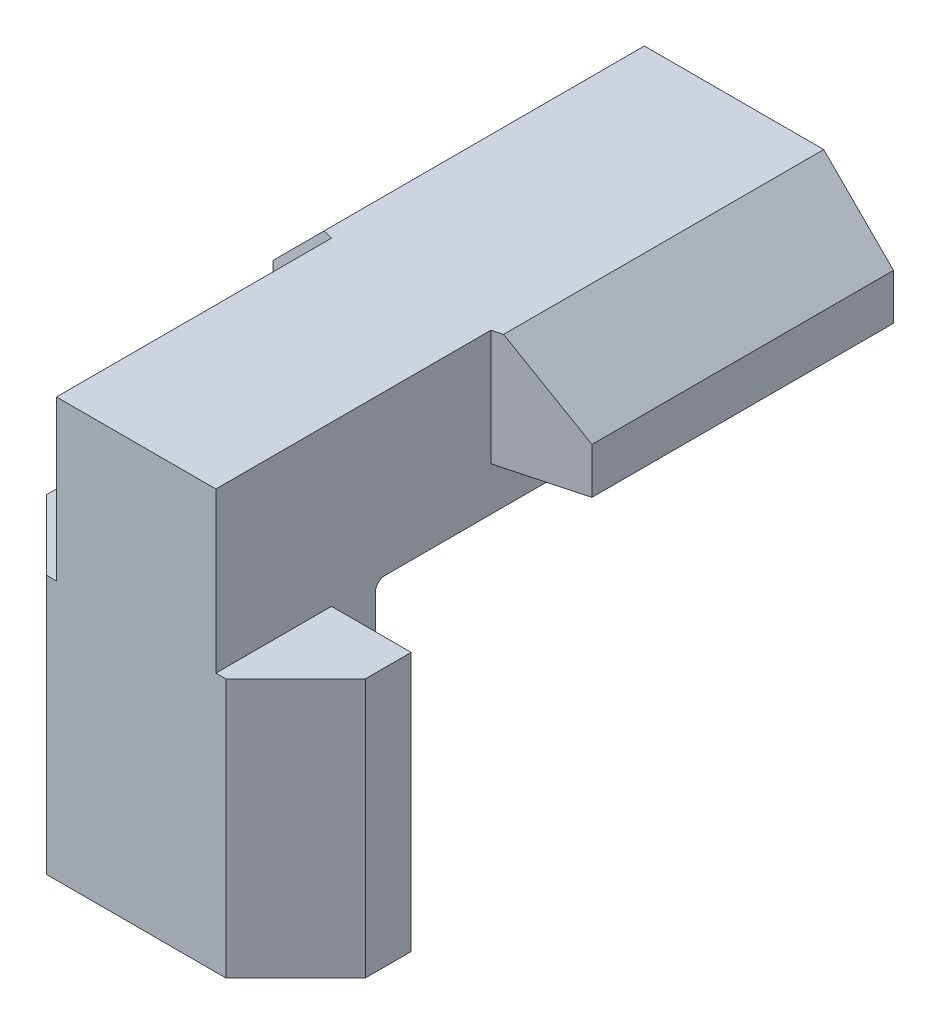
ISO-10303-21;
HEADER;
FILE_DESCRIPTION(('STEP AP214'),'2;1');
FILE_NAME('part.step','',(''),(''),'','','');
FILE_SCHEMA(('AUTOMOTIVE_DESIGN { 1 0 10303 214 1 1 1 1 }'));
ENDSEC;
DATA;
#1=APPLICATION_CONTEXT('core data for automotive mechanical design processes');
#2=APPLICATION_PROTOCOL_DEFINITION('international standard','automotive_design',2000,#1);
#3=PRODUCT_CONTEXT('',#1,'mechanical');
#4=PRODUCT('Part','Part','',(#3));
#5=PRODUCT_RELATED_PRODUCT_CATEGORY('part','',(#4));
#6=PRODUCT_DEFINITION_FORMATION('','',#4);
#7=PRODUCT_DEFINITION_CONTEXT('part definition',#1,'design');
#8=PRODUCT_DEFINITION('design','',#6,#7);
#9=PRODUCT_DEFINITION_SHAPE('','',#8);
#10=(LENGTH_UNIT() NAMED_UNIT(*) SI_UNIT(.MILLI.,.METRE.));
#11=(NAMED_UNIT(*) PLANE_ANGLE_UNIT() SI_UNIT($,.RADIAN.));
#12=(NAMED_UNIT(*) SI_UNIT($,.STERADIAN.) SOLID_ANGLE_UNIT());
#13=UNCERTAINTY_MEASURE_WITH_UNIT(LENGTH_MEASURE(1.E-05),#10,'distance_accuracy_value','');
#14=(GEOMETRIC_REPRESENTATION_CONTEXT(3) GLOBAL_UNCERTAINTY_ASSIGNED_CONTEXT((#13)) GLOBAL_UNIT_ASSIGNED_CONTEXT((#10,
#11,#12)) REPRESENTATION_CONTEXT('',''));
#15=CARTESIAN_POINT('',(0.,0.,0.));
#16=DIRECTION('',(0.,0.,1.));
#17=DIRECTION('',(1.,0.,0.));
#18=AXIS2_PLACEMENT_3D('',#15,#16,#17);
#19=CARTESIAN_POINT('',(8.,-13.,4.5));
#20=DIRECTION('',(1.,0.,0.));
#21=DIRECTION('',(0.,0.,-1.));
#22=AXIS2_PLACEMENT_3D('',#19,#20,#21);
#23=PLANE('',#22);
#24=DIRECTION('',(0.,1.,0.));
#25=VECTOR('',#24,1.);
#26=CARTESIAN_POINT('',(8.,-13.,2.2));
#27=LINE('',#26,#25);
#28=CARTESIAN_POINT('',(8.,0.,2.2));
#29=VERTEX_POINT('',#28);
#30=CARTESIAN_POINT('',(8.,-13.,2.2));
#31=VERTEX_POINT('',#30);
#32=EDGE_CURVE('E275',#29,#31,#27,.F.);
#33=ORIENTED_EDGE('',*,*,#32,.F.);
#34=DIRECTION('',(0.,0.,-1.));
#35=VECTOR('',#34,1.);
#36=CARTESIAN_POINT('',(8.,0.,8.));
#37=LINE('',#36,#35);
#38=CARTESIAN_POINT('',(8.,0.,4.5));
#39=VERTEX_POINT('',#38);
#40=EDGE_CURVE('E312',#29,#39,#37,.F.);
#41=ORIENTED_EDGE('',*,*,#40,.T.);
#42=DIRECTION('',(0.,1.,0.));
#43=VECTOR('',#42,1.);
#44=CARTESIAN_POINT('',(8.,-13.,4.5));
#45=LINE('',#44,#43);
#46=CARTESIAN_POINT('',(8.,-13.,4.5));
#47=VERTEX_POINT('',#46);
#48=EDGE_CURVE('E339',#47,#39,#45,.T.);
#49=ORIENTED_EDGE('',*,*,#48,.F.);
#50=DIRECTION('',(0.,0.,1.));
#51=VECTOR('',#50,1.);
#52=CARTESIAN_POINT('',(8.,-13.,0.));
#53=LINE('',#52,#51);
#54=EDGE_CURVE('E263',#47,#31,#53,.F.);
#55=ORIENTED_EDGE('',*,*,#54,.T.);
#56=EDGE_LOOP('',(#33,#41,#49,#55));
#57=FACE_BOUND('',#56,.T.);
#58=ADVANCED_FACE('F15',(#57),#23,.T.);
#59=CARTESIAN_POINT('',(-8.,-13.,2.2));
#60=DIRECTION('',(-1.,0.,0.));
#61=DIRECTION('',(0.,0.,1.));
#62=AXIS2_PLACEMENT_3D('',#59,#60,#61);
#63=PLANE('',#62);
#64=DIRECTION('',(0.,1.,0.));
#65=VECTOR('',#64,1.);
#66=CARTESIAN_POINT('',(-8.,-13.,4.5));
#67=LINE('',#66,#65);
#68=CARTESIAN_POINT('',(-8.,0.,4.5));
#69=VERTEX_POINT('',#68);
#70=CARTESIAN_POINT('',(-8.,-13.,4.5));
#71=VERTEX_POINT('',#70);
#72=EDGE_CURVE('E340',#69,#71,#67,.F.);
#73=ORIENTED_EDGE('',*,*,#72,.F.);
#74=DIRECTION('',(0.,0.,-1.));
#75=VECTOR('',#74,1.);
#76=CARTESIAN_POINT('',(-8.,0.,8.));
#77=LINE('',#76,#75);
#78=CARTESIAN_POINT('',(-8.,0.,2.2));
#79=VERTEX_POINT('',#78);
#80=EDGE_CURVE('E377',#69,#79,#77,.T.);
#81=ORIENTED_EDGE('',*,*,#80,.T.);
#82=DIRECTION('',(0.,1.,0.));
#83=VECTOR('',#82,1.);
#84=CARTESIAN_POINT('',(-8.,-13.,2.2));
#85=LINE('',#84,#83);
#86=CARTESIAN_POINT('',(-8.,-13.,2.2));
#87=VERTEX_POINT('',#86);
#88=EDGE_CURVE('E421',#87,#79,#85,.T.);
#89=ORIENTED_EDGE('',*,*,#88,.F.);
#90=DIRECTION('',(0.,0.,1.));
#91=VECTOR('',#90,1.);
#92=CARTESIAN_POINT('',(-8.,-13.,0.));
#93=LINE('',#92,#91);
#94=EDGE_CURVE('E329',#87,#71,#93,.T.);
#95=ORIENTED_EDGE('',*,*,#94,.T.);
#96=EDGE_LOOP('',(#73,#81,#89,#95));
#97=FACE_BOUND('',#96,.T.);
#98=ADVANCED_FACE('F542',(#97),#63,.T.);
#99=CARTESIAN_POINT('',(4.064410551115,-0.5,-0.5));
#100=DIRECTION('',(-1.,0.,0.));
#101=DIRECTION('',(0.,0.,1.));
#102=AXIS2_PLACEMENT_3D('',#99,#100,#101);
#103=CYLINDRICAL_SURFACE('',#102,0.5);
#104=DIRECTION('',(1.,0.,0.));
#105=VECTOR('',#104,1.);
#106=CARTESIAN_POINT('',(-4.,0.,-0.5));
#107=LINE('',#106,#105);
#108=CARTESIAN_POINT('',(4.,0.,-0.5));
#109=VERTEX_POINT('',#108);
#110=CARTESIAN_POINT('',(-4.,0.,-0.5));
#111=VERTEX_POINT('',#110);
#112=EDGE_CURVE('E191',#109,#111,#107,.F.);
#113=ORIENTED_EDGE('',*,*,#112,.F.);
#114=CARTESIAN_POINT('',(4.,-0.5,-0.5));
#115=DIRECTION('',(-1.,0.,0.));
#116=DIRECTION('',(0.,0.,1.));
#117=AXIS2_PLACEMENT_3D('',#114,#115,#116);
#118=CIRCLE('',#117,0.5);
#119=CARTESIAN_POINT('',(4.,-0.5,0.));
#120=VERTEX_POINT('',#119);
#121=EDGE_CURVE('E19',#120,#109,#118,.T.);
#122=ORIENTED_EDGE('',*,*,#121,.F.);
#123=DIRECTION('',(-1.,0.,0.));
#124=VECTOR('',#123,1.);
#125=CARTESIAN_POINT('',(4.,-0.5,0.));
#126=LINE('',#125,#124);
#127=CARTESIAN_POINT('',(-4.,-0.5,0.));
#128=VERTEX_POINT('',#127);
#129=EDGE_CURVE('E241',#128,#120,#126,.F.);
#130=ORIENTED_EDGE('',*,*,#129,.F.);
#131=CARTESIAN_POINT('',(-4.,-0.5,-0.5));
#132=DIRECTION('',(-1.,0.,0.));
#133=DIRECTION('',(0.,0.,1.));
#134=AXIS2_PLACEMENT_3D('',#131,#132,#133);
#135=CIRCLE('',#134,0.5);
#136=EDGE_CURVE('E424',#111,#128,#135,.F.);
#137=ORIENTED_EDGE('',*,*,#136,.F.);
#138=EDGE_LOOP('',(#113,#122,#130,#137));
#139=FACE_BOUND('',#138,.T.);
#140=ADVANCED_FACE('F479',(#139),#103,.F.);
#141=CARTESIAN_POINT('',(8.,-13.,4.5));
#142=DIRECTION('',(1.,0.,0.));
#143=DIRECTION('',(0.,0.,-1.));
#144=AXIS2_PLACEMENT_3D('',#141,#142,#143);
#145=PLANE('',#144);
#146=DIRECTION('',(0.,0.,1.));
#147=VECTOR('',#146,1.);
#148=CARTESIAN_POINT('',(8.,4.5,8.));
#149=LINE('',#148,#147);
#150=CARTESIAN_POINT('',(7.99999999999998,4.5,-6.87179676972409));
#151=VERTEX_POINT('',#150);
#152=CARTESIAN_POINT('',(8.,4.5,-22.));
#153=VERTEX_POINT('',#152);
#154=EDGE_CURVE('E180',#151,#153,#149,.F.);
#155=ORIENTED_EDGE('',*,*,#154,.F.);
#156=DIRECTION('',(0.,1.,0.));
#157=VECTOR('',#156,1.);
#158=CARTESIAN_POINT('',(7.99999999999991,0.,-6.87179676972434));
#159=LINE('',#158,#157);
#160=CARTESIAN_POINT('',(8.,2.2,-6.871796769724));
#161=VERTEX_POINT('',#160);
#162=EDGE_CURVE('E183',#151,#161,#159,.F.);
#163=ORIENTED_EDGE('',*,*,#162,.T.);
#164=DIRECTION('',(0.,0.,-1.));
#165=VECTOR('',#164,1.);
#166=CARTESIAN_POINT('',(8.,2.2,8.));
#167=LINE('',#166,#165);
#168=CARTESIAN_POINT('',(8.,2.2,-22.));
#169=VERTEX_POINT('',#168);
#170=EDGE_CURVE('E392',#169,#161,#167,.F.);
#171=ORIENTED_EDGE('',*,*,#170,.F.);
#172=DIRECTION('',(0.,1.,0.));
#173=VECTOR('',#172,1.);
#174=CARTESIAN_POINT('',(8.,-13.,-22.));
#175=LINE('',#174,#173);
#176=EDGE_CURVE('E186',#169,#153,#175,.T.);
#177=ORIENTED_EDGE('',*,*,#176,.T.);
#178=EDGE_LOOP('',(#155,#163,#171,#177));
#179=FACE_BOUND('',#178,.T.);
#180=ADVANCED_FACE('F182',(#179),#145,.T.);
#181=CARTESIAN_POINT('',(-8.,-13.,2.2));
#182=DIRECTION('',(-1.,0.,0.));
#183=DIRECTION('',(0.,0.,1.));
#184=AXIS2_PLACEMENT_3D('',#181,#182,#183);
#185=PLANE('',#184);
#186=DIRECTION('',(0.,0.,-1.));
#187=VECTOR('',#186,1.);
#188=CARTESIAN_POINT('',(-8.,2.2,8.));
#189=LINE('',#188,#187);
#190=CARTESIAN_POINT('',(-7.99999999999993,2.2,-6.87179676972425));
#191=VERTEX_POINT('',#190);
#192=CARTESIAN_POINT('',(-8.,2.2,-22.));
#193=VERTEX_POINT('',#192);
#194=EDGE_CURVE('E366',#191,#193,#189,.T.);
#195=ORIENTED_EDGE('',*,*,#194,.F.);
#196=DIRECTION('',(0.,1.,0.));
#197=VECTOR('',#196,1.);
#198=CARTESIAN_POINT('',(-7.9999999999998,0.,-6.87179676972476));
#199=LINE('',#198,#197);
#200=CARTESIAN_POINT('',(-7.9999999999999,4.5,-6.87179676972448));
#201=VERTEX_POINT('',#200);
#202=EDGE_CURVE('E376',#191,#201,#199,.T.);
#203=ORIENTED_EDGE('',*,*,#202,.T.);
#204=DIRECTION('',(0.,0.,1.));
#205=VECTOR('',#204,1.);
#206=CARTESIAN_POINT('',(-8.,4.5,8.));
#207=LINE('',#206,#205);
#208=CARTESIAN_POINT('',(-8.,4.5,-22.));
#209=VERTEX_POINT('',#208);
#210=EDGE_CURVE('E405',#209,#201,#207,.T.);
#211=ORIENTED_EDGE('',*,*,#210,.F.);
#212=DIRECTION('',(0.,1.,0.));
#213=VECTOR('',#212,1.);
#214=CARTESIAN_POINT('',(-8.,-13.,-22.));
#215=LINE('',#214,#213);
#216=EDGE_CURVE('E201',#209,#193,#215,.F.);
#217=ORIENTED_EDGE('',*,*,#216,.T.);
#218=EDGE_LOOP('',(#195,#203,#211,#217));
#219=FACE_BOUND('',#218,.T.);
#220=ADVANCED_FACE('F597',(#219),#185,.T.);
#221=CARTESIAN_POINT('',(-4.,-13.,2.2));
#222=DIRECTION('',(0.,0.,-1.));
#223=DIRECTION('',(-1.,0.,0.));
#224=AXIS2_PLACEMENT_3D('',#221,#222,#223);
#225=PLANE('',#224);
#226=ORIENTED_EDGE('',*,*,#88,.T.);
#227=DIRECTION('',(1.,0.,0.));
#228=VECTOR('',#227,1.);
#229=CARTESIAN_POINT('',(-4.,0.,2.2));
#230=LINE('',#229,#228);
#231=CARTESIAN_POINT('',(-4.,0.,2.2));
#232=VERTEX_POINT('',#231);
#233=EDGE_CURVE('E423',#79,#232,#230,.T.);
#234=ORIENTED_EDGE('',*,*,#233,.T.);
#235=DIRECTION('',(0.,1.,0.));
#236=VECTOR('',#235,1.);
#237=CARTESIAN_POINT('',(-4.,-13.,2.2));
#238=LINE('',#237,#236);
#239=CARTESIAN_POINT('',(-4.,-13.,2.2));
#240=VERTEX_POINT('',#239);
#241=EDGE_CURVE('E346',#240,#232,#238,.T.);
#242=ORIENTED_EDGE('',*,*,#241,.F.);
#243=DIRECTION('',(1.,0.,0.));
#244=VECTOR('',#243,1.);
#245=CARTESIAN_POINT('',(0.,-13.,2.2));
#246=LINE('',#245,#244);
#247=EDGE_CURVE('E262',#240,#87,#246,.F.);
#248=ORIENTED_EDGE('',*,*,#247,.T.);
#249=EDGE_LOOP('',(#226,#234,#242,#248));
#250=FACE_BOUND('',#249,.T.);
#251=ADVANCED_FACE('F492',(#250),#225,.T.);
#252=CARTESIAN_POINT('',(-4.,0.,8.));
#253=DIRECTION('',(0.,-1.,0.));
#254=DIRECTION('',(0.,0.,-1.));
#255=AXIS2_PLACEMENT_3D('',#252,#253,#254);
#256=PLANE('',#255);
#257=DIRECTION('',(0.707106781186548,0.,0.707106781186548));
#258=VECTOR('',#257,1.);
#259=CARTESIAN_POINT('',(-8.,0.,4.5));
#260=LINE('',#259,#258);
#261=CARTESIAN_POINT('',(-4.5,0.,8.));
#262=VERTEX_POINT('',#261);
#263=EDGE_CURVE('E336',#262,#69,#260,.F.);
#264=ORIENTED_EDGE('',*,*,#263,.F.);
#265=DIRECTION('',(1.,0.,0.));
#266=VECTOR('',#265,1.);
#267=CARTESIAN_POINT('',(-4.,0.,8.));
#268=LINE('',#267,#266);
#269=CARTESIAN_POINT('',(-4.,0.,8.));
#270=VERTEX_POINT('',#269);
#271=EDGE_CURVE('E446',#270,#262,#268,.F.);
#272=ORIENTED_EDGE('',*,*,#271,.F.);
#273=DIRECTION('',(0.,0.,1.));
#274=VECTOR('',#273,1.);
#275=CARTESIAN_POINT('',(-4.,0.,0.));
#276=LINE('',#275,#274);
#277=EDGE_CURVE('E371',#232,#270,#276,.T.);
#278=ORIENTED_EDGE('',*,*,#277,.F.);
#279=ORIENTED_EDGE('',*,*,#233,.F.);
#280=ORIENTED_EDGE('',*,*,#80,.F.);
#281=EDGE_LOOP('',(#264,#272,#278,#279,#280));
#282=FACE_BOUND('',#281,.T.);
#283=ADVANCED_FACE('F497',(#282),#256,.F.);
#284=CARTESIAN_POINT('',(-10.,0.,-7.407695154587));
#285=DIRECTION('',(0.258819045102493,0.,-0.965925826289076));
#286=DIRECTION('',(-0.965925826289076,0.,-0.258819045102493));
#287=AXIS2_PLACEMENT_3D('',#284,#285,#286);
#288=PLANE('',#287);
#289=ORIENTED_EDGE('',*,*,#202,.F.);
#290=DIRECTION('',(-0.965925826289098,0.,-0.25881904510241));
#291=VECTOR('',#290,1.);
#292=CARTESIAN_POINT('',(-4.,2.2,-5.8));
#293=LINE('',#292,#291);
#294=CARTESIAN_POINT('',(-4.,2.2,-5.8));
#295=VERTEX_POINT('',#294);
#296=EDGE_CURVE('E363',#295,#191,#293,.T.);
#297=ORIENTED_EDGE('',*,*,#296,.F.);
#298=DIRECTION('',(0.,1.,0.));
#299=VECTOR('',#298,1.);
#300=CARTESIAN_POINT('',(-4.,-13.,-5.8));
#301=LINE('',#300,#299);
#302=CARTESIAN_POINT('',(-3.99999999999996,8.,-5.80000000000014));
#303=VERTEX_POINT('',#302);
#304=EDGE_CURVE('E360',#303,#295,#301,.F.);
#305=ORIENTED_EDGE('',*,*,#304,.F.);
#306=DIRECTION('',(-0.965925826289076,0.,-0.258819045102493));
#307=VECTOR('',#306,1.);
#308=CARTESIAN_POINT('',(-10.,8.,-7.407695154587));
#309=LINE('',#308,#307);
#310=CARTESIAN_POINT('',(-4.5,8.,-5.933974596216));
#311=VERTEX_POINT('',#310);
#312=EDGE_CURVE('E374',#311,#303,#309,.F.);
#313=ORIENTED_EDGE('',*,*,#312,.F.);
#314=DIRECTION('',(0.69474659060689,0.69474659060689,0.186156787897207));
#315=VECTOR('',#314,1.);
#316=CARTESIAN_POINT('',(-8.,4.5,-6.87179676972401));
#317=LINE('',#316,#315);
#318=EDGE_CURVE('E347',#201,#311,#317,.T.);
#319=ORIENTED_EDGE('',*,*,#318,.F.);
#320=EDGE_LOOP('',(#289,#297,#305,#313,#319));
#321=FACE_BOUND('',#320,.T.);
#322=ADVANCED_FACE('F507',(#321),#288,.F.);
#323=CARTESIAN_POINT('',(-8.,2.2,8.));
#324=DIRECTION('',(0.,-1.,0.));
#325=DIRECTION('',(0.,0.,-1.));
#326=AXIS2_PLACEMENT_3D('',#323,#324,#325);
#327=PLANE('',#326);
#328=DIRECTION('',(0.,0.,1.));
#329=VECTOR('',#328,1.);
#330=CARTESIAN_POINT('',(-4.,2.2,0.));
#331=LINE('',#330,#329);
#332=CARTESIAN_POINT('',(-4.,2.2,-22.));
#333=VERTEX_POINT('',#332);
#334=EDGE_CURVE('E352',#295,#333,#331,.F.);
#335=ORIENTED_EDGE('',*,*,#334,.F.);
#336=ORIENTED_EDGE('',*,*,#296,.T.);
#337=ORIENTED_EDGE('',*,*,#194,.T.);
#338=DIRECTION('',(1.,0.,0.));
#339=VECTOR('',#338,1.);
#340=CARTESIAN_POINT('',(-4.5,2.2,-22.));
#341=LINE('',#340,#339);
#342=EDGE_CURVE('E203',#193,#333,#341,.T.);
#343=ORIENTED_EDGE('',*,*,#342,.T.);
#344=EDGE_LOOP('',(#335,#336,#337,#343));
#345=FACE_BOUND('',#344,.T.);
#346=ADVANCED_FACE('F510',(#345),#327,.T.);
#347=CARTESIAN_POINT('',(-8.,-13.,4.5));
#348=DIRECTION('',(-0.707106781186548,0.,0.707106781186548));
#349=DIRECTION('',(0.707106781186548,0.,0.707106781186548));
#350=AXIS2_PLACEMENT_3D('',#347,#348,#349);
#351=PLANE('',#350);
#352=DIRECTION('',(0.,1.,0.));
#353=VECTOR('',#352,1.);
#354=CARTESIAN_POINT('',(-4.5,-13.,8.));
#355=LINE('',#354,#353);
#356=CARTESIAN_POINT('',(-4.5,-13.,8.));
#357=VERTEX_POINT('',#356);
#358=EDGE_CURVE('E213',#262,#357,#355,.F.);
#359=ORIENTED_EDGE('',*,*,#358,.F.);
#360=ORIENTED_EDGE('',*,*,#263,.T.);
#361=ORIENTED_EDGE('',*,*,#72,.T.);
#362=DIRECTION('',(0.707106781186547,0.,0.707106781186547));
#363=VECTOR('',#362,1.);
#364=CARTESIAN_POINT('',(-8.,-13.,4.5));
#365=LINE('',#364,#363);
#366=EDGE_CURVE('E252',#71,#357,#365,.T.);
#367=ORIENTED_EDGE('',*,*,#366,.T.);
#368=EDGE_LOOP('',(#359,#360,#361,#367));
#369=FACE_BOUND('',#368,.T.);
#370=ADVANCED_FACE('F540',(#369),#351,.T.);
#371=CARTESIAN_POINT('',(4.5,-13.,8.));
#372=DIRECTION('',(0.707106781186548,0.,0.707106781186548));
#373=DIRECTION('',(0.707106781186548,0.,-0.707106781186548));
#374=AXIS2_PLACEMENT_3D('',#371,#372,#373);
#375=PLANE('',#374);
#376=ORIENTED_EDGE('',*,*,#48,.T.);
#377=DIRECTION('',(-0.707106781186547,0.,0.707106781186547));
#378=VECTOR('',#377,1.);
#379=CARTESIAN_POINT('',(8.,0.,4.5));
#380=LINE('',#379,#378);
#381=CARTESIAN_POINT('',(4.5,0.,8.));
#382=VERTEX_POINT('',#381);
#383=EDGE_CURVE('E310',#39,#382,#380,.T.);
#384=ORIENTED_EDGE('',*,*,#383,.T.);
#385=DIRECTION('',(0.,1.,0.));
#386=VECTOR('',#385,1.);
#387=CARTESIAN_POINT('',(4.5,-13.,8.));
#388=LINE('',#387,#386);
#389=CARTESIAN_POINT('',(4.5,-13.,8.));
#390=VERTEX_POINT('',#389);
#391=EDGE_CURVE('E287',#390,#382,#388,.T.);
#392=ORIENTED_EDGE('',*,*,#391,.F.);
#393=DIRECTION('',(0.707106781186547,0.,-0.707106781186547));
#394=VECTOR('',#393,1.);
#395=CARTESIAN_POINT('',(4.5,-13.,8.));
#396=LINE('',#395,#394);
#397=EDGE_CURVE('E274',#390,#47,#396,.T.);
#398=ORIENTED_EDGE('',*,*,#397,.T.);
#399=EDGE_LOOP('',(#376,#384,#392,#398));
#400=FACE_BOUND('',#399,.T.);
#401=ADVANCED_FACE('F538',(#400),#375,.T.);
#402=CARTESIAN_POINT('',(4.,2.2,8.));
#403=DIRECTION('',(0.,-1.,0.));
#404=DIRECTION('',(0.,0.,-1.));
#405=AXIS2_PLACEMENT_3D('',#402,#403,#404);
#406=PLANE('',#405);
#407=ORIENTED_EDGE('',*,*,#170,.T.);
#408=DIRECTION('',(-0.965925826289076,0.,0.258819045102493));
#409=VECTOR('',#408,1.);
#410=CARTESIAN_POINT('',(4.,2.2,-5.8));
#411=LINE('',#410,#409);
#412=CARTESIAN_POINT('',(4.,2.2,-5.8));
#413=VERTEX_POINT('',#412);
#414=EDGE_CURVE('E196',#161,#413,#411,.T.);
#415=ORIENTED_EDGE('',*,*,#414,.T.);
#416=DIRECTION('',(0.,0.,-1.));
#417=VECTOR('',#416,1.);
#418=CARTESIAN_POINT('',(4.,2.2,2.2));
#419=LINE('',#418,#417);
#420=CARTESIAN_POINT('',(4.,2.2,-22.));
#421=VERTEX_POINT('',#420);
#422=EDGE_CURVE('E233',#421,#413,#419,.F.);
#423=ORIENTED_EDGE('',*,*,#422,.F.);
#424=DIRECTION('',(1.,0.,0.));
#425=VECTOR('',#424,1.);
#426=CARTESIAN_POINT('',(-4.5,2.2,-22.));
#427=LINE('',#426,#425);
#428=EDGE_CURVE('E299',#421,#169,#427,.T.);
#429=ORIENTED_EDGE('',*,*,#428,.T.);
#430=EDGE_LOOP('',(#407,#415,#423,#429));
#431=FACE_BOUND('',#430,.T.);
#432=ADVANCED_FACE('F522',(#431),#406,.T.);
#433=CARTESIAN_POINT('',(4.,0.,-5.8));
#434=DIRECTION('',(-0.258819045102493,0.,-0.965925826289076));
#435=DIRECTION('',(-0.965925826289076,0.,0.258819045102493));
#436=AXIS2_PLACEMENT_3D('',#433,#434,#435);
#437=PLANE('',#436);
#438=ORIENTED_EDGE('',*,*,#414,.F.);
#439=ORIENTED_EDGE('',*,*,#162,.F.);
#440=DIRECTION('',(0.69474659060689,-0.69474659060689,-0.186156787897207));
#441=VECTOR('',#440,1.);
#442=CARTESIAN_POINT('',(4.5,8.,-5.93397459621601));
#443=LINE('',#442,#441);
#444=CARTESIAN_POINT('',(4.50000000000006,8.,-5.93397459621579));
#445=VERTEX_POINT('',#444);
#446=EDGE_CURVE('E190',#445,#151,#443,.T.);
#447=ORIENTED_EDGE('',*,*,#446,.F.);
#448=DIRECTION('',(-0.965925826289076,0.,0.258819045102493));
#449=VECTOR('',#448,1.);
#450=CARTESIAN_POINT('',(4.,8.,-5.8));
#451=LINE('',#450,#449);
#452=CARTESIAN_POINT('',(4.,8.,-5.8));
#453=VERTEX_POINT('',#452);
#454=EDGE_CURVE('E165',#453,#445,#451,.F.);
#455=ORIENTED_EDGE('',*,*,#454,.F.);
#456=DIRECTION('',(0.,1.,0.));
#457=VECTOR('',#456,1.);
#458=CARTESIAN_POINT('',(4.,-13.,-5.8));
#459=LINE('',#458,#457);
#460=EDGE_CURVE('E231',#413,#453,#459,.T.);
#461=ORIENTED_EDGE('',*,*,#460,.F.);
#462=EDGE_LOOP('',(#438,#439,#447,#455,#461));
#463=FACE_BOUND('',#462,.T.);
#464=ADVANCED_FACE('F194',(#463),#437,.F.);
#465=CARTESIAN_POINT('',(-4.,0.,8.));
#466=DIRECTION('',(0.,-1.,0.));
#467=DIRECTION('',(0.,0.,-1.));
#468=AXIS2_PLACEMENT_3D('',#465,#466,#467);
#469=PLANE('',#468);
#470=DIRECTION('',(-1.,0.,0.));
#471=VECTOR('',#470,1.);
#472=CARTESIAN_POINT('',(8.,0.,2.2));
#473=LINE('',#472,#471);
#474=CARTESIAN_POINT('',(4.,0.,2.2));
#475=VERTEX_POINT('',#474);
#476=EDGE_CURVE('E271',#475,#29,#473,.F.);
#477=ORIENTED_EDGE('',*,*,#476,.F.);
#478=DIRECTION('',(0.,0.,-1.));
#479=VECTOR('',#478,1.);
#480=CARTESIAN_POINT('',(4.,0.,2.2));
#481=LINE('',#480,#479);
#482=CARTESIAN_POINT('',(4.,0.,8.));
#483=VERTEX_POINT('',#482);
#484=EDGE_CURVE('E268',#483,#475,#481,.T.);
#485=ORIENTED_EDGE('',*,*,#484,.F.);
#486=DIRECTION('',(1.,0.,0.));
#487=VECTOR('',#486,1.);
#488=CARTESIAN_POINT('',(-4.5,0.,8.));
#489=LINE('',#488,#487);
#490=EDGE_CURVE('E285',#382,#483,#489,.F.);
#491=ORIENTED_EDGE('',*,*,#490,.F.);
#492=ORIENTED_EDGE('',*,*,#383,.F.);
#493=ORIENTED_EDGE('',*,*,#40,.F.);
#494=EDGE_LOOP('',(#477,#485,#491,#492,#493));
#495=FACE_BOUND('',#494,.T.);
#496=ADVANCED_FACE('F528',(#495),#469,.F.);
#497=CARTESIAN_POINT('',(8.,-13.,2.2));
#498=DIRECTION('',(0.,0.,-1.));
#499=DIRECTION('',(-1.,0.,0.));
#500=AXIS2_PLACEMENT_3D('',#497,#498,#499);
#501=PLANE('',#500);
#502=DIRECTION('',(0.,1.,0.));
#503=VECTOR('',#502,1.);
#504=CARTESIAN_POINT('',(4.,-13.,2.2));
#505=LINE('',#504,#503);
#506=CARTESIAN_POINT('',(4.,-13.,2.2));
#507=VERTEX_POINT('',#506);
#508=EDGE_CURVE('E257',#475,#507,#505,.F.);
#509=ORIENTED_EDGE('',*,*,#508,.F.);
#510=ORIENTED_EDGE('',*,*,#476,.T.);
#511=ORIENTED_EDGE('',*,*,#32,.T.);
#512=DIRECTION('',(1.,0.,0.));
#513=VECTOR('',#512,1.);
#514=CARTESIAN_POINT('',(0.,-13.,2.2));
#515=LINE('',#514,#513);
#516=EDGE_CURVE('E260',#31,#507,#515,.F.);
#517=ORIENTED_EDGE('',*,*,#516,.T.);
#518=EDGE_LOOP('',(#509,#510,#511,#517));
#519=FACE_BOUND('',#518,.T.);
#520=ADVANCED_FACE('F532',(#519),#501,.T.);
#521=CARTESIAN_POINT('',(0.,-13.,0.));
#522=DIRECTION('',(0.,1.,0.));
#523=DIRECTION('',(0.,0.,1.));
#524=AXIS2_PLACEMENT_3D('',#521,#522,#523);
#525=PLANE('',#524);
#526=ORIENTED_EDGE('',*,*,#366,.F.);
#527=ORIENTED_EDGE('',*,*,#94,.F.);
#528=ORIENTED_EDGE('',*,*,#247,.F.);
#529=DIRECTION('',(0.,0.,1.));
#530=VECTOR('',#529,1.);
#531=CARTESIAN_POINT('',(-4.,-13.,0.));
#532=LINE('',#531,#530);
#533=CARTESIAN_POINT('',(-4.,-13.,0.));
#534=VERTEX_POINT('',#533);
#535=EDGE_CURVE('E343',#534,#240,#532,.T.);
#536=ORIENTED_EDGE('',*,*,#535,.F.);
#537=DIRECTION('',(-1.,0.,0.));
#538=VECTOR('',#537,1.);
#539=CARTESIAN_POINT('',(4.,-13.,0.));
#540=LINE('',#539,#538);
#541=CARTESIAN_POINT('',(4.,-13.,0.));
#542=VERTEX_POINT('',#541);
#543=EDGE_CURVE('E249',#542,#534,#540,.T.);
#544=ORIENTED_EDGE('',*,*,#543,.F.);
#545=DIRECTION('',(0.,0.,-1.));
#546=VECTOR('',#545,1.);
#547=CARTESIAN_POINT('',(4.,-13.,2.2));
#548=LINE('',#547,#546);
#549=EDGE_CURVE('E228',#507,#542,#548,.T.);
#550=ORIENTED_EDGE('',*,*,#549,.F.);
#551=ORIENTED_EDGE('',*,*,#516,.F.);
#552=ORIENTED_EDGE('',*,*,#54,.F.);
#553=ORIENTED_EDGE('',*,*,#397,.F.);
#554=DIRECTION('',(1.,0.,0.));
#555=VECTOR('',#554,1.);
#556=CARTESIAN_POINT('',(-4.5,-13.,8.));
#557=LINE('',#556,#555);
#558=EDGE_CURVE('E317',#357,#390,#557,.T.);
#559=ORIENTED_EDGE('',*,*,#558,.F.);
#560=EDGE_LOOP('',(#526,#527,#528,#536,#544,#550,#551,#552,#553,#559));
#561=FACE_BOUND('',#560,.T.);
#562=ADVANCED_FACE('F486',(#561),#525,.F.);
#563=CARTESIAN_POINT('',(4.,-13.,0.));
#564=DIRECTION('',(0.,0.,-1.));
#565=DIRECTION('',(-1.,0.,0.));
#566=AXIS2_PLACEMENT_3D('',#563,#564,#565);
#567=PLANE('',#566);
#568=DIRECTION('',(0.,1.,0.));
#569=VECTOR('',#568,1.);
#570=CARTESIAN_POINT('',(-4.,-13.,0.));
#571=LINE('',#570,#569);
#572=EDGE_CURVE('E210',#128,#534,#571,.F.);
#573=ORIENTED_EDGE('',*,*,#572,.F.);
#574=ORIENTED_EDGE('',*,*,#129,.T.);
#575=DIRECTION('',(0.,1.,0.));
#576=VECTOR('',#575,1.);
#577=CARTESIAN_POINT('',(4.,-13.,0.));
#578=LINE('',#577,#576);
#579=EDGE_CURVE('E224',#542,#120,#578,.T.);
#580=ORIENTED_EDGE('',*,*,#579,.F.);
#581=ORIENTED_EDGE('',*,*,#543,.T.);
#582=EDGE_LOOP('',(#573,#574,#580,#581));
#583=FACE_BOUND('',#582,.T.);
#584=ADVANCED_FACE('F482',(#583),#567,.T.);
#585=CARTESIAN_POINT('',(-4.,0.,8.));
#586=DIRECTION('',(0.,-1.,0.));
#587=DIRECTION('',(0.,0.,-1.));
#588=AXIS2_PLACEMENT_3D('',#585,#586,#587);
#589=PLANE('',#588);
#590=DIRECTION('',(0.,0.,-1.));
#591=VECTOR('',#590,1.);
#592=CARTESIAN_POINT('',(4.,0.,2.2));
#593=LINE('',#592,#591);
#594=CARTESIAN_POINT('',(4.,0.,-22.));
#595=VERTEX_POINT('',#594);
#596=EDGE_CURVE('E222',#109,#595,#593,.T.);
#597=ORIENTED_EDGE('',*,*,#596,.F.);
#598=ORIENTED_EDGE('',*,*,#112,.T.);
#599=DIRECTION('',(0.,0.,1.));
#600=VECTOR('',#599,1.);
#601=CARTESIAN_POINT('',(-4.,0.,0.));
#602=LINE('',#601,#600);
#603=CARTESIAN_POINT('',(-4.,0.,-22.));
#604=VERTEX_POINT('',#603);
#605=EDGE_CURVE('E214',#604,#111,#602,.T.);
#606=ORIENTED_EDGE('',*,*,#605,.F.);
#607=DIRECTION('',(1.,0.,0.));
#608=VECTOR('',#607,1.);
#609=CARTESIAN_POINT('',(-4.5,0.,-22.));
#610=LINE('',#609,#608);
#611=EDGE_CURVE('E297',#604,#595,#610,.T.);
#612=ORIENTED_EDGE('',*,*,#611,.T.);
#613=EDGE_LOOP('',(#597,#598,#606,#612));
#614=FACE_BOUND('',#613,.T.);
#615=ADVANCED_FACE('F518',(#614),#589,.T.);
#616=CARTESIAN_POINT('',(8.,4.5,8.));
#617=DIRECTION('',(0.707106781186548,0.707106781186548,0.));
#618=DIRECTION('',(-0.707106781186548,0.707106781186548,0.));
#619=AXIS2_PLACEMENT_3D('',#616,#617,#618);
#620=PLANE('',#619);
#621=DIRECTION('',(0.,0.,1.));
#622=VECTOR('',#621,1.);
#623=CARTESIAN_POINT('',(4.5,8.,0.));
#624=LINE('',#623,#622);
#625=CARTESIAN_POINT('',(4.5,8.,-22.));
#626=VERTEX_POINT('',#625);
#627=EDGE_CURVE('E200',#445,#626,#624,.F.);
#628=ORIENTED_EDGE('',*,*,#627,.F.);
#629=ORIENTED_EDGE('',*,*,#446,.T.);
#630=ORIENTED_EDGE('',*,*,#154,.T.);
#631=DIRECTION('',(-0.707106781186547,0.707106781186547,0.));
#632=VECTOR('',#631,1.);
#633=CARTESIAN_POINT('',(8.,4.5,-22.));
#634=LINE('',#633,#632);
#635=EDGE_CURVE('E207',#153,#626,#634,.T.);
#636=ORIENTED_EDGE('',*,*,#635,.T.);
#637=EDGE_LOOP('',(#628,#629,#630,#636));
#638=FACE_BOUND('',#637,.T.);
#639=ADVANCED_FACE('F198',(#638),#620,.T.);
#640=CARTESIAN_POINT('',(-4.5,-13.,-22.));
#641=DIRECTION('',(0.,0.,1.));
#642=DIRECTION('',(1.,0.,0.));
#643=AXIS2_PLACEMENT_3D('',#640,#641,#642);
#644=PLANE('',#643);
#645=ORIENTED_EDGE('',*,*,#176,.F.);
#646=ORIENTED_EDGE('',*,*,#428,.F.);
#647=DIRECTION('',(0.,1.,0.));
#648=VECTOR('',#647,1.);
#649=CARTESIAN_POINT('',(4.,-13.,-22.));
#650=LINE('',#649,#648);
#651=EDGE_CURVE('E242',#595,#421,#650,.T.);
#652=ORIENTED_EDGE('',*,*,#651,.F.);
#653=ORIENTED_EDGE('',*,*,#611,.F.);
#654=DIRECTION('',(0.,1.,0.));
#655=VECTOR('',#654,1.);
#656=CARTESIAN_POINT('',(-4.,-13.,-22.));
#657=LINE('',#656,#655);
#658=EDGE_CURVE('E219',#333,#604,#657,.F.);
#659=ORIENTED_EDGE('',*,*,#658,.F.);
#660=ORIENTED_EDGE('',*,*,#342,.F.);
#661=ORIENTED_EDGE('',*,*,#216,.F.);
#662=DIRECTION('',(-0.707106781186548,-0.707106781186548,0.));
#663=VECTOR('',#662,1.);
#664=CARTESIAN_POINT('',(-4.5,8.,-22.));
#665=LINE('',#664,#663);
#666=CARTESIAN_POINT('',(-4.5,8.,-22.));
#667=VERTEX_POINT('',#666);
#668=EDGE_CURVE('E209',#667,#209,#665,.T.);
#669=ORIENTED_EDGE('',*,*,#668,.F.);
#670=DIRECTION('',(1.,0.,0.));
#671=VECTOR('',#670,1.);
#672=CARTESIAN_POINT('',(0.,8.,-22.));
#673=LINE('',#672,#671);
#674=EDGE_CURVE('E234',#626,#667,#673,.F.);
#675=ORIENTED_EDGE('',*,*,#674,.F.);
#676=ORIENTED_EDGE('',*,*,#635,.F.);
#677=EDGE_LOOP('',(#645,#646,#652,#653,#659,#660,#661,#669,#675,#676));
#678=FACE_BOUND('',#677,.T.);
#679=ADVANCED_FACE('F514',(#678),#644,.F.);
#680=CARTESIAN_POINT('',(-4.5,8.,8.));
#681=DIRECTION('',(-0.707106781186548,0.707106781186548,0.));
#682=DIRECTION('',(-0.707106781186548,-0.707106781186548,0.));
#683=AXIS2_PLACEMENT_3D('',#680,#681,#682);
#684=PLANE('',#683);
#685=ORIENTED_EDGE('',*,*,#210,.T.);
#686=ORIENTED_EDGE('',*,*,#318,.T.);
#687=DIRECTION('',(0.,0.,1.));
#688=VECTOR('',#687,1.);
#689=CARTESIAN_POINT('',(-4.5,8.,0.));
#690=LINE('',#689,#688);
#691=EDGE_CURVE('E237',#667,#311,#690,.T.);
#692=ORIENTED_EDGE('',*,*,#691,.F.);
#693=ORIENTED_EDGE('',*,*,#668,.T.);
#694=EDGE_LOOP('',(#685,#686,#692,#693));
#695=FACE_BOUND('',#694,.T.);
#696=ADVANCED_FACE('F563',(#695),#684,.T.);
#697=CARTESIAN_POINT('',(-4.,-13.,0.));
#698=DIRECTION('',(-1.,0.,0.));
#699=DIRECTION('',(0.,0.,1.));
#700=AXIS2_PLACEMENT_3D('',#697,#698,#699);
#701=PLANE('',#700);
#702=ORIENTED_EDGE('',*,*,#136,.T.);
#703=ORIENTED_EDGE('',*,*,#572,.T.);
#704=ORIENTED_EDGE('',*,*,#535,.T.);
#705=ORIENTED_EDGE('',*,*,#241,.T.);
#706=ORIENTED_EDGE('',*,*,#277,.T.);
#707=DIRECTION('',(0.,1.,0.));
#708=VECTOR('',#707,1.);
#709=CARTESIAN_POINT('',(-4.,-13.,8.));
#710=LINE('',#709,#708);
#711=CARTESIAN_POINT('',(-4.,8.,8.));
#712=VERTEX_POINT('',#711);
#713=EDGE_CURVE('E245',#712,#270,#710,.F.);
#714=ORIENTED_EDGE('',*,*,#713,.F.);
#715=DIRECTION('',(0.,0.,1.));
#716=VECTOR('',#715,1.);
#717=CARTESIAN_POINT('',(-4.,8.,0.));
#718=LINE('',#717,#716);
#719=EDGE_CURVE('E294',#303,#712,#718,.T.);
#720=ORIENTED_EDGE('',*,*,#719,.F.);
#721=ORIENTED_EDGE('',*,*,#304,.T.);
#722=ORIENTED_EDGE('',*,*,#334,.T.);
#723=ORIENTED_EDGE('',*,*,#658,.T.);
#724=ORIENTED_EDGE('',*,*,#605,.T.);
#725=EDGE_LOOP('',(#702,#703,#704,#705,#706,#714,#720,#721,#722,#723,#724));
#726=FACE_BOUND('',#725,.T.);
#727=ADVANCED_FACE('F476',(#726),#701,.T.);
#728=CARTESIAN_POINT('',(-4.5,-13.,8.));
#729=DIRECTION('',(0.,0.,1.));
#730=DIRECTION('',(1.,0.,0.));
#731=AXIS2_PLACEMENT_3D('',#728,#729,#730);
#732=PLANE('',#731);
#733=ORIENTED_EDGE('',*,*,#713,.T.);
#734=ORIENTED_EDGE('',*,*,#271,.T.);
#735=ORIENTED_EDGE('',*,*,#358,.T.);
#736=ORIENTED_EDGE('',*,*,#558,.T.);
#737=ORIENTED_EDGE('',*,*,#391,.T.);
#738=ORIENTED_EDGE('',*,*,#490,.T.);
#739=DIRECTION('',(0.,1.,0.));
#740=VECTOR('',#739,1.);
#741=CARTESIAN_POINT('',(4.,-13.,8.));
#742=LINE('',#741,#740);
#743=CARTESIAN_POINT('',(4.,8.,8.));
#744=VERTEX_POINT('',#743);
#745=EDGE_CURVE('E34',#744,#483,#742,.F.);
#746=ORIENTED_EDGE('',*,*,#745,.F.);
#747=DIRECTION('',(1.,0.,0.));
#748=VECTOR('',#747,1.);
#749=CARTESIAN_POINT('',(0.,8.,8.));
#750=LINE('',#749,#748);
#751=EDGE_CURVE('E25',#712,#744,#750,.T.);
#752=ORIENTED_EDGE('',*,*,#751,.F.);
#753=EDGE_LOOP('',(#733,#734,#735,#736,#737,#738,#746,#752));
#754=FACE_BOUND('',#753,.T.);
#755=ADVANCED_FACE('F499',(#754),#732,.T.);
#756=CARTESIAN_POINT('',(4.,-13.,2.2));
#757=DIRECTION('',(1.,0.,0.));
#758=DIRECTION('',(0.,0.,-1.));
#759=AXIS2_PLACEMENT_3D('',#756,#757,#758);
#760=PLANE('',#759);
#761=ORIENTED_EDGE('',*,*,#121,.T.);
#762=ORIENTED_EDGE('',*,*,#596,.T.);
#763=ORIENTED_EDGE('',*,*,#651,.T.);
#764=ORIENTED_EDGE('',*,*,#422,.T.);
#765=ORIENTED_EDGE('',*,*,#460,.T.);
#766=DIRECTION('',(0.,0.,1.));
#767=VECTOR('',#766,1.);
#768=CARTESIAN_POINT('',(4.,8.,0.));
#769=LINE('',#768,#767);
#770=EDGE_CURVE('E9',#744,#453,#769,.F.);
#771=ORIENTED_EDGE('',*,*,#770,.F.);
#772=ORIENTED_EDGE('',*,*,#745,.T.);
#773=ORIENTED_EDGE('',*,*,#484,.T.);
#774=ORIENTED_EDGE('',*,*,#508,.T.);
#775=ORIENTED_EDGE('',*,*,#549,.T.);
#776=ORIENTED_EDGE('',*,*,#579,.T.);
#777=EDGE_LOOP('',(#761,#762,#763,#764,#765,#771,#772,#773,#774,#775,#776));
#778=FACE_BOUND('',#777,.T.);
#779=ADVANCED_FACE('F519',(#778),#760,.T.);
#780=CARTESIAN_POINT('',(0.,8.,0.));
#781=DIRECTION('',(0.,1.,0.));
#782=DIRECTION('',(0.,0.,1.));
#783=AXIS2_PLACEMENT_3D('',#780,#781,#782);
#784=PLANE('',#783);
#785=ORIENTED_EDGE('',*,*,#751,.T.);
#786=ORIENTED_EDGE('',*,*,#770,.T.);
#787=ORIENTED_EDGE('',*,*,#454,.T.);
#788=ORIENTED_EDGE('',*,*,#627,.T.);
#789=ORIENTED_EDGE('',*,*,#674,.T.);
#790=ORIENTED_EDGE('',*,*,#691,.T.);
#791=ORIENTED_EDGE('',*,*,#312,.T.);
#792=ORIENTED_EDGE('',*,*,#719,.T.);
#793=EDGE_LOOP('',(#785,#786,#787,#788,#789,#790,#791,#792));
#794=FACE_BOUND('',#793,.T.);
#795=ADVANCED_FACE('F17',(#794),#784,.T.);
#796=CLOSED_SHELL('',(#58,#98,#140,#180,#220,#251,#283,#322,#346,#370,#401,#432,#464,#496,#520,
#562,#584,#615,#639,#679,#696,#727,#755,#779,#795));
#797=MANIFOLD_SOLID_BREP('B1',#796);
#798=ADVANCED_BREP_SHAPE_REPRESENTATION('',(#18,#797),#14);
#799=SHAPE_DEFINITION_REPRESENTATION(#9,#798);
ENDSEC;
END-ISO-10303-21;
